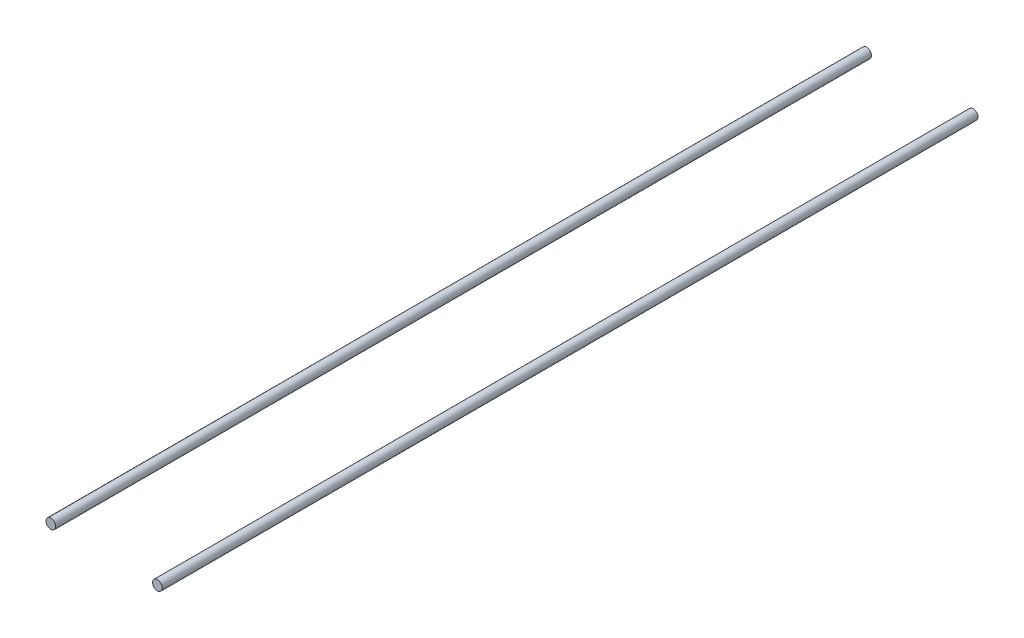
ISO-10303-21;
HEADER;
FILE_DESCRIPTION(('STEP AP214'),'2;1');
FILE_NAME('part.step','',(''),(''),'','','');
FILE_SCHEMA(('AUTOMOTIVE_DESIGN { 1 0 10303 214 1 1 1 1 }'));
ENDSEC;
DATA;
#1=APPLICATION_CONTEXT('core data for automotive mechanical design processes');
#2=APPLICATION_PROTOCOL_DEFINITION('international standard','automotive_design',2000,#1);
#3=PRODUCT_CONTEXT('',#1,'mechanical');
#4=PRODUCT('Part','Part','',(#3));
#5=PRODUCT_RELATED_PRODUCT_CATEGORY('part','',(#4));
#6=PRODUCT_DEFINITION_FORMATION('','',#4);
#7=PRODUCT_DEFINITION_CONTEXT('part definition',#1,'design');
#8=PRODUCT_DEFINITION('design','',#6,#7);
#9=PRODUCT_DEFINITION_SHAPE('','',#8);
#10=(LENGTH_UNIT() NAMED_UNIT(*) SI_UNIT(.MILLI.,.METRE.));
#11=(NAMED_UNIT(*) PLANE_ANGLE_UNIT() SI_UNIT($,.RADIAN.));
#12=(NAMED_UNIT(*) SI_UNIT($,.STERADIAN.) SOLID_ANGLE_UNIT());
#13=UNCERTAINTY_MEASURE_WITH_UNIT(LENGTH_MEASURE(1.E-05),#10,'distance_accuracy_value','');
#14=(GEOMETRIC_REPRESENTATION_CONTEXT(3) GLOBAL_UNCERTAINTY_ASSIGNED_CONTEXT((#13)) GLOBAL_UNIT_ASSIGNED_CONTEXT((#10,
#11,#12)) REPRESENTATION_CONTEXT('',''));
#15=CARTESIAN_POINT('',(0.,0.,0.));
#16=DIRECTION('',(0.,0.,1.));
#17=DIRECTION('',(1.,0.,0.));
#18=AXIS2_PLACEMENT_3D('',#15,#16,#17);
#19=CARTESIAN_POINT('',(-65.5000000000002,-30.8877524092694,1103.2));
#20=DIRECTION('',(0.,0.,-1.));
#21=DIRECTION('',(0.,1.,0.));
#22=AXIS2_PLACEMENT_3D('',#19,#20,#21);
#23=CYLINDRICAL_SURFACE('',#22,6.00000000000001);
#24=CARTESIAN_POINT('',(-65.5000000000002,-30.8877524092694,1103.2));
#25=DIRECTION('',(0.,0.,-1.));
#26=DIRECTION('',(0.,-1.,0.));
#27=AXIS2_PLACEMENT_3D('',#24,#25,#26);
#28=CIRCLE('',#27,6.00000000000001);
#29=CARTESIAN_POINT('',(-65.5000000000002,-36.8877524092694,1103.2));
#30=VERTEX_POINT('',#29);
#31=EDGE_CURVE('E53',#30,#30,#28,.T.);
#32=ORIENTED_EDGE('',*,*,#31,.T.);
#33=EDGE_LOOP('',(#32));
#34=FACE_BOUND('',#33,.T.);
#35=CARTESIAN_POINT('',(-65.5000000000002,-30.8877524092693,99.9999999999999));
#36=DIRECTION('',(0.,0.,-1.));
#37=DIRECTION('',(0.,-1.,0.));
#38=AXIS2_PLACEMENT_3D('',#35,#36,#37);
#39=CIRCLE('',#38,6.00000000000001);
#40=CARTESIAN_POINT('',(-65.5000000000002,-36.8877524092693,99.9999999999999));
#41=VERTEX_POINT('',#40);
#42=EDGE_CURVE('E11',#41,#41,#39,.T.);
#43=ORIENTED_EDGE('',*,*,#42,.F.);
#44=EDGE_LOOP('',(#43));
#45=FACE_BOUND('',#44,.T.);
#46=ADVANCED_FACE('F50',(#34,#45),#23,.T.);
#47=CARTESIAN_POINT('',(-65.5000000000002,-30.8877524092694,1103.2));
#48=DIRECTION('',(0.,0.,1.));
#49=DIRECTION('',(0.,-1.,0.));
#50=AXIS2_PLACEMENT_3D('',#47,#48,#49);
#51=PLANE('',#50);
#52=ORIENTED_EDGE('',*,*,#31,.F.);
#53=EDGE_LOOP('',(#52));
#54=FACE_BOUND('',#53,.T.);
#55=ADVANCED_FACE('F62',(#54),#51,.T.);
#56=CARTESIAN_POINT('',(-65.5000000000002,-30.8877524092693,99.9999999999999));
#57=DIRECTION('',(0.,0.,1.));
#58=DIRECTION('',(0.,-1.,0.));
#59=AXIS2_PLACEMENT_3D('',#56,#57,#58);
#60=PLANE('',#59);
#61=ORIENTED_EDGE('',*,*,#42,.T.);
#62=EDGE_LOOP('',(#61));
#63=FACE_BOUND('',#62,.T.);
#64=ADVANCED_FACE('F47',(#63),#60,.F.);
#65=CLOSED_SHELL('',(#46,#55,#64));
#66=MANIFOLD_SOLID_BREP('B2',#65);
#67=CARTESIAN_POINT('',(65.4999999999998,-30.8877524092694,1103.2));
#68=DIRECTION('',(0.,0.,-1.));
#69=DIRECTION('',(0.,1.,0.));
#70=AXIS2_PLACEMENT_3D('',#67,#68,#69);
#71=CYLINDRICAL_SURFACE('',#70,6.);
#72=CARTESIAN_POINT('',(65.4999999999998,-30.8877524092694,1103.2));
#73=DIRECTION('',(0.,0.,-1.));
#74=DIRECTION('',(0.,1.,0.));
#75=AXIS2_PLACEMENT_3D('',#72,#73,#74);
#76=CIRCLE('',#75,6.);
#77=CARTESIAN_POINT('',(65.4999999999998,-24.8877524092694,1103.2));
#78=VERTEX_POINT('',#77);
#79=EDGE_CURVE('E46',#78,#78,#76,.T.);
#80=ORIENTED_EDGE('',*,*,#79,.T.);
#81=EDGE_LOOP('',(#80));
#82=FACE_BOUND('',#81,.T.);
#83=CARTESIAN_POINT('',(65.4999999999998,-30.8877524092693,99.9999999999999));
#84=DIRECTION('',(0.,0.,-1.));
#85=DIRECTION('',(0.,1.,0.));
#86=AXIS2_PLACEMENT_3D('',#83,#84,#85);
#87=CIRCLE('',#86,6.);
#88=CARTESIAN_POINT('',(65.4999999999998,-24.8877524092693,99.9999999999999));
#89=VERTEX_POINT('',#88);
#90=EDGE_CURVE('E94',#89,#89,#87,.T.);
#91=ORIENTED_EDGE('',*,*,#90,.F.);
#92=EDGE_LOOP('',(#91));
#93=FACE_BOUND('',#92,.T.);
#94=ADVANCED_FACE('F86',(#82,#93),#71,.T.);
#95=CARTESIAN_POINT('',(65.4999999999998,-30.8877524092694,1103.2));
#96=DIRECTION('',(0.,0.,-1.));
#97=DIRECTION('',(0.,1.,0.));
#98=AXIS2_PLACEMENT_3D('',#95,#96,#97);
#99=PLANE('',#98);
#100=ORIENTED_EDGE('',*,*,#79,.F.);
#101=EDGE_LOOP('',(#100));
#102=FACE_BOUND('',#101,.T.);
#103=ADVANCED_FACE('F103',(#102),#99,.F.);
#104=CARTESIAN_POINT('',(65.4999999999998,-30.8877524092693,99.9999999999999));
#105=DIRECTION('',(0.,0.,-1.));
#106=DIRECTION('',(0.,1.,0.));
#107=AXIS2_PLACEMENT_3D('',#104,#105,#106);
#108=PLANE('',#107);
#109=ORIENTED_EDGE('',*,*,#90,.T.);
#110=EDGE_LOOP('',(#109));
#111=FACE_BOUND('',#110,.T.);
#112=ADVANCED_FACE('F99',(#111),#108,.T.);
#113=CLOSED_SHELL('',(#94,#103,#112));
#114=MANIFOLD_SOLID_BREP('B6',#113);
#115=ADVANCED_BREP_SHAPE_REPRESENTATION('',(#18,#66,#114),#14);
#116=SHAPE_DEFINITION_REPRESENTATION(#9,#115);
ENDSEC;
END-ISO-10303-21;
